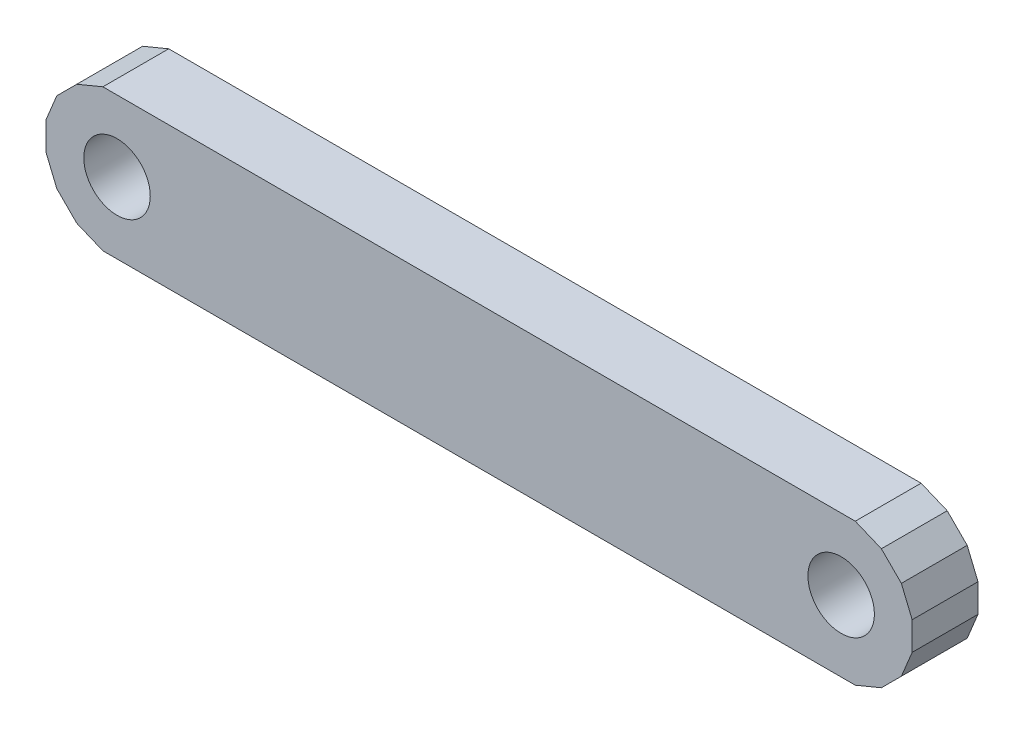
ISO-10303-21;
HEADER;
FILE_DESCRIPTION(('STEP AP214'),'2;1');
FILE_NAME('part.step','',(''),(''),'','','');
FILE_SCHEMA(('AUTOMOTIVE_DESIGN { 1 0 10303 214 1 1 1 1 }'));
ENDSEC;
DATA;
#1=APPLICATION_CONTEXT('core data for automotive mechanical design processes');
#2=APPLICATION_PROTOCOL_DEFINITION('international standard','automotive_design',2000,#1);
#3=PRODUCT_CONTEXT('',#1,'mechanical');
#4=PRODUCT('Part','Part','',(#3));
#5=PRODUCT_RELATED_PRODUCT_CATEGORY('part','',(#4));
#6=PRODUCT_DEFINITION_FORMATION('','',#4);
#7=PRODUCT_DEFINITION_CONTEXT('part definition',#1,'design');
#8=PRODUCT_DEFINITION('design','',#6,#7);
#9=PRODUCT_DEFINITION_SHAPE('','',#8);
#10=(LENGTH_UNIT() NAMED_UNIT(*) SI_UNIT(.MILLI.,.METRE.));
#11=(NAMED_UNIT(*) PLANE_ANGLE_UNIT() SI_UNIT($,.RADIAN.));
#12=(NAMED_UNIT(*) SI_UNIT($,.STERADIAN.) SOLID_ANGLE_UNIT());
#13=UNCERTAINTY_MEASURE_WITH_UNIT(LENGTH_MEASURE(1.E-05),#10,'distance_accuracy_value','');
#14=(GEOMETRIC_REPRESENTATION_CONTEXT(3) GLOBAL_UNCERTAINTY_ASSIGNED_CONTEXT((#13)) GLOBAL_UNIT_ASSIGNED_CONTEXT((#10,
#11,#12)) REPRESENTATION_CONTEXT('',''));
#15=CARTESIAN_POINT('',(0.,0.,0.));
#16=DIRECTION('',(0.,0.,1.));
#17=DIRECTION('',(1.,0.,0.));
#18=AXIS2_PLACEMENT_3D('',#15,#16,#17);
#19=CARTESIAN_POINT('',(0.,0.,18.));
#20=DIRECTION('',(0.,0.,1.));
#21=DIRECTION('',(1.,0.,0.));
#22=AXIS2_PLACEMENT_3D('',#19,#20,#21);
#23=PLANE('',#22);
#24=CARTESIAN_POINT('',(0.,0.,18.));
#25=DIRECTION('',(0.,0.,1.));
#26=DIRECTION('',(1.,0.,0.));
#27=AXIS2_PLACEMENT_3D('',#24,#25,#26);
#28=CIRCLE('',#27,5.05);
#29=CARTESIAN_POINT('',(5.05,0.,18.));
#30=VERTEX_POINT('',#29);
#31=EDGE_CURVE('E192',#30,#30,#28,.T.);
#32=ORIENTED_EDGE('',*,*,#31,.F.);
#33=EDGE_LOOP('',(#32));
#34=FACE_BOUND('',#33,.T.);
#35=DIRECTION('',(-0.382683432365089,-0.923879532511287,0.));
#36=VECTOR('',#35,1.);
#37=CARTESIAN_POINT('',(-9.146165735328,6.11127256321562,18.));
#38=LINE('',#37,#36);
#39=CARTESIAN_POINT('',(-9.146165735328,6.11127256321562,18.));
#40=VERTEX_POINT('',#39);
#41=CARTESIAN_POINT('',(-10.7886380844355,2.14599354217741,18.));
#42=VERTEX_POINT('',#41);
#43=EDGE_CURVE('E219',#40,#42,#38,.T.);
#44=ORIENTED_EDGE('',*,*,#43,.T.);
#45=DIRECTION('',(0.,-1.,0.));
#46=VECTOR('',#45,1.);
#47=CARTESIAN_POINT('',(-10.7886380844355,2.14599354217741,18.));
#48=LINE('',#47,#46);
#49=CARTESIAN_POINT('',(-10.7886380844355,-2.14599354217741,18.));
#50=VERTEX_POINT('',#49);
#51=EDGE_CURVE('E127',#42,#50,#48,.T.);
#52=ORIENTED_EDGE('',*,*,#51,.T.);
#53=DIRECTION('',(0.38268343236509,-0.923879532511287,0.));
#54=VECTOR('',#53,1.);
#55=CARTESIAN_POINT('',(-10.7886380844355,-2.14599354217741,18.));
#56=LINE('',#55,#54);
#57=CARTESIAN_POINT('',(-9.146165735328,-6.11127256321562,18.));
#58=VERTEX_POINT('',#57);
#59=EDGE_CURVE('E258',#50,#58,#56,.T.);
#60=ORIENTED_EDGE('',*,*,#59,.T.);
#61=DIRECTION('',(0.707106781186548,-0.707106781186547,0.));
#62=VECTOR('',#61,1.);
#63=CARTESIAN_POINT('',(-9.146165735328,-6.11127256321562,18.));
#64=LINE('',#63,#62);
#65=CARTESIAN_POINT('',(-6.11127256321562,-9.146165735328,18.));
#66=VERTEX_POINT('',#65);
#67=EDGE_CURVE('E277',#58,#66,#64,.T.);
#68=ORIENTED_EDGE('',*,*,#67,.T.);
#69=DIRECTION('',(0.923879532511287,-0.38268343236509,0.));
#70=VECTOR('',#69,1.);
#71=CARTESIAN_POINT('',(-6.11127256321562,-9.146165735328,18.));
#72=LINE('',#71,#70);
#73=CARTESIAN_POINT('',(-2.14599354217742,-10.7886380844355,18.));
#74=VERTEX_POINT('',#73);
#75=EDGE_CURVE('E274',#66,#74,#72,.T.);
#76=ORIENTED_EDGE('',*,*,#75,.T.);
#77=DIRECTION('',(1.,0.,0.));
#78=VECTOR('',#77,1.);
#79=CARTESIAN_POINT('',(-2.14599354217742,-10.7886380844355,18.));
#80=LINE('',#79,#78);
#81=CARTESIAN_POINT('',(112.145993542177,-10.7886380844355,18.));
#82=VERTEX_POINT('',#81);
#83=EDGE_CURVE('E276',#74,#82,#80,.T.);
#84=ORIENTED_EDGE('',*,*,#83,.T.);
#85=DIRECTION('',(0.923879532511287,0.38268343236509,0.));
#86=VECTOR('',#85,1.);
#87=CARTESIAN_POINT('',(112.145993542177,-10.7886380844355,18.));
#88=LINE('',#87,#86);
#89=CARTESIAN_POINT('',(116.111272563216,-9.146165735328,18.));
#90=VERTEX_POINT('',#89);
#91=EDGE_CURVE('E279',#82,#90,#88,.T.);
#92=ORIENTED_EDGE('',*,*,#91,.T.);
#93=DIRECTION('',(0.707106781186548,0.707106781186547,0.));
#94=VECTOR('',#93,1.);
#95=CARTESIAN_POINT('',(116.111272563216,-9.146165735328,18.));
#96=LINE('',#95,#94);
#97=CARTESIAN_POINT('',(119.146165735328,-6.11127256321562,18.));
#98=VERTEX_POINT('',#97);
#99=EDGE_CURVE('E285',#90,#98,#96,.T.);
#100=ORIENTED_EDGE('',*,*,#99,.T.);
#101=DIRECTION('',(0.382683432365091,0.923879532511286,0.));
#102=VECTOR('',#101,1.);
#103=CARTESIAN_POINT('',(119.146165735328,-6.11127256321562,18.));
#104=LINE('',#103,#102);
#105=CARTESIAN_POINT('',(120.788638084436,-2.14599354217742,18.));
#106=VERTEX_POINT('',#105);
#107=EDGE_CURVE('E287',#98,#106,#104,.T.);
#108=ORIENTED_EDGE('',*,*,#107,.T.);
#109=DIRECTION('',(0.,1.,0.));
#110=VECTOR('',#109,1.);
#111=CARTESIAN_POINT('',(120.788638084436,-2.14599354217742,18.));
#112=LINE('',#111,#110);
#113=CARTESIAN_POINT('',(120.788638084436,2.14599354217741,18.));
#114=VERTEX_POINT('',#113);
#115=EDGE_CURVE('E289',#106,#114,#112,.T.);
#116=ORIENTED_EDGE('',*,*,#115,.T.);
#117=DIRECTION('',(-0.38268343236509,0.923879532511286,0.));
#118=VECTOR('',#117,1.);
#119=CARTESIAN_POINT('',(120.788638084436,2.14599354217741,18.));
#120=LINE('',#119,#118);
#121=CARTESIAN_POINT('',(119.146165735328,6.11127256321562,18.));
#122=VERTEX_POINT('',#121);
#123=EDGE_CURVE('E291',#114,#122,#120,.T.);
#124=ORIENTED_EDGE('',*,*,#123,.T.);
#125=DIRECTION('',(-0.707106781186548,0.707106781186547,0.));
#126=VECTOR('',#125,1.);
#127=CARTESIAN_POINT('',(119.146165735328,6.11127256321562,18.));
#128=LINE('',#127,#126);
#129=CARTESIAN_POINT('',(116.111272563216,9.146165735328,18.));
#130=VERTEX_POINT('',#129);
#131=EDGE_CURVE('E293',#122,#130,#128,.T.);
#132=ORIENTED_EDGE('',*,*,#131,.T.);
#133=DIRECTION('',(-0.923879532511286,0.382683432365091,0.));
#134=VECTOR('',#133,1.);
#135=CARTESIAN_POINT('',(116.111272563216,9.146165735328,18.));
#136=LINE('',#135,#134);
#137=CARTESIAN_POINT('',(112.145993542177,10.7886380844355,18.));
#138=VERTEX_POINT('',#137);
#139=EDGE_CURVE('E170',#130,#138,#136,.T.);
#140=ORIENTED_EDGE('',*,*,#139,.T.);
#141=DIRECTION('',(-1.,0.,0.));
#142=VECTOR('',#141,1.);
#143=CARTESIAN_POINT('',(112.145993542177,10.7886380844355,18.));
#144=LINE('',#143,#142);
#145=CARTESIAN_POINT('',(-2.14599354217741,10.7886380844355,18.));
#146=VERTEX_POINT('',#145);
#147=EDGE_CURVE('E164',#138,#146,#144,.T.);
#148=ORIENTED_EDGE('',*,*,#147,.T.);
#149=DIRECTION('',(-0.923879532511287,-0.38268343236509,0.));
#150=VECTOR('',#149,1.);
#151=CARTESIAN_POINT('',(-2.14599354217741,10.7886380844355,18.));
#152=LINE('',#151,#150);
#153=CARTESIAN_POINT('',(-6.11127256321562,9.146165735328,18.));
#154=VERTEX_POINT('',#153);
#155=EDGE_CURVE('E168',#146,#154,#152,.T.);
#156=ORIENTED_EDGE('',*,*,#155,.T.);
#157=DIRECTION('',(-0.707106781186548,-0.707106781186547,0.));
#158=VECTOR('',#157,1.);
#159=CARTESIAN_POINT('',(-6.11127256321562,9.146165735328,18.));
#160=LINE('',#159,#158);
#161=EDGE_CURVE('E60',#154,#40,#160,.T.);
#162=ORIENTED_EDGE('',*,*,#161,.T.);
#163=EDGE_LOOP('',(#44,#52,#60,#68,#76,#84,#92,#100,#108,#116,#124,#132,#140,#148,#156,#162));
#164=FACE_BOUND('',#163,.T.);
#165=CARTESIAN_POINT('',(110.,0.,18.));
#166=DIRECTION('',(0.,0.,1.));
#167=DIRECTION('',(1.,0.,0.));
#168=AXIS2_PLACEMENT_3D('',#165,#166,#167);
#169=CIRCLE('',#168,5.05);
#170=CARTESIAN_POINT('',(115.05,0.,18.));
#171=VERTEX_POINT('',#170);
#172=EDGE_CURVE('E335',#171,#171,#169,.T.);
#173=ORIENTED_EDGE('',*,*,#172,.F.);
#174=EDGE_LOOP('',(#173));
#175=FACE_BOUND('',#174,.T.);
#176=ADVANCED_FACE('F43',(#34,#164,#175),#23,.T.);
#177=CARTESIAN_POINT('',(0.,0.,8.));
#178=DIRECTION('',(0.,0.,1.));
#179=DIRECTION('',(1.,0.,0.));
#180=AXIS2_PLACEMENT_3D('',#177,#178,#179);
#181=PLANE('',#180);
#182=DIRECTION('',(-0.382683432365089,-0.923879532511287,0.));
#183=VECTOR('',#182,1.);
#184=CARTESIAN_POINT('',(-9.146165735328,6.11127256321562,8.));
#185=LINE('',#184,#183);
#186=CARTESIAN_POINT('',(-9.146165735328,6.11127256321562,8.));
#187=VERTEX_POINT('',#186);
#188=CARTESIAN_POINT('',(-10.7886380844355,2.14599354217741,8.));
#189=VERTEX_POINT('',#188);
#190=EDGE_CURVE('E188',#187,#189,#185,.T.);
#191=ORIENTED_EDGE('',*,*,#190,.F.);
#192=DIRECTION('',(-0.707106781186548,-0.707106781186547,0.));
#193=VECTOR('',#192,1.);
#194=CARTESIAN_POINT('',(-6.11127256321562,9.146165735328,8.));
#195=LINE('',#194,#193);
#196=CARTESIAN_POINT('',(-6.11127256321562,9.146165735328,8.));
#197=VERTEX_POINT('',#196);
#198=EDGE_CURVE('E119',#197,#187,#195,.T.);
#199=ORIENTED_EDGE('',*,*,#198,.F.);
#200=DIRECTION('',(-0.923879532511287,-0.38268343236509,0.));
#201=VECTOR('',#200,1.);
#202=CARTESIAN_POINT('',(-2.14599354217741,10.7886380844355,8.));
#203=LINE('',#202,#201);
#204=CARTESIAN_POINT('',(-2.14599354217741,10.7886380844355,8.));
#205=VERTEX_POINT('',#204);
#206=EDGE_CURVE('E113',#205,#197,#203,.T.);
#207=ORIENTED_EDGE('',*,*,#206,.F.);
#208=DIRECTION('',(-1.,0.,0.));
#209=VECTOR('',#208,1.);
#210=CARTESIAN_POINT('',(112.145993542177,10.7886380844355,8.));
#211=LINE('',#210,#209);
#212=CARTESIAN_POINT('',(112.145993542177,10.7886380844355,8.));
#213=VERTEX_POINT('',#212);
#214=EDGE_CURVE('E178',#213,#205,#211,.T.);
#215=ORIENTED_EDGE('',*,*,#214,.F.);
#216=DIRECTION('',(-0.923879532511286,0.382683432365091,0.));
#217=VECTOR('',#216,1.);
#218=CARTESIAN_POINT('',(116.111272563216,9.146165735328,8.));
#219=LINE('',#218,#217);
#220=CARTESIAN_POINT('',(116.111272563216,9.146165735328,8.));
#221=VERTEX_POINT('',#220);
#222=EDGE_CURVE('E214',#221,#213,#219,.T.);
#223=ORIENTED_EDGE('',*,*,#222,.F.);
#224=DIRECTION('',(-0.707106781186548,0.707106781186547,0.));
#225=VECTOR('',#224,1.);
#226=CARTESIAN_POINT('',(119.146165735328,6.11127256321562,8.));
#227=LINE('',#226,#225);
#228=CARTESIAN_POINT('',(119.146165735328,6.11127256321562,8.));
#229=VERTEX_POINT('',#228);
#230=EDGE_CURVE('E212',#229,#221,#227,.T.);
#231=ORIENTED_EDGE('',*,*,#230,.F.);
#232=DIRECTION('',(-0.38268343236509,0.923879532511286,0.));
#233=VECTOR('',#232,1.);
#234=CARTESIAN_POINT('',(120.788638084436,2.14599354217741,8.));
#235=LINE('',#234,#233);
#236=CARTESIAN_POINT('',(120.788638084436,2.14599354217741,8.));
#237=VERTEX_POINT('',#236);
#238=EDGE_CURVE('E210',#237,#229,#235,.T.);
#239=ORIENTED_EDGE('',*,*,#238,.F.);
#240=DIRECTION('',(0.,1.,0.));
#241=VECTOR('',#240,1.);
#242=CARTESIAN_POINT('',(120.788638084436,-2.14599354217742,8.));
#243=LINE('',#242,#241);
#244=CARTESIAN_POINT('',(120.788638084436,-2.14599354217742,8.));
#245=VERTEX_POINT('',#244);
#246=EDGE_CURVE('E208',#245,#237,#243,.T.);
#247=ORIENTED_EDGE('',*,*,#246,.F.);
#248=DIRECTION('',(0.382683432365091,0.923879532511286,0.));
#249=VECTOR('',#248,1.);
#250=CARTESIAN_POINT('',(119.146165735328,-6.11127256321562,8.));
#251=LINE('',#250,#249);
#252=CARTESIAN_POINT('',(119.146165735328,-6.11127256321562,8.));
#253=VERTEX_POINT('',#252);
#254=EDGE_CURVE('E206',#253,#245,#251,.T.);
#255=ORIENTED_EDGE('',*,*,#254,.F.);
#256=DIRECTION('',(0.707106781186548,0.707106781186547,0.));
#257=VECTOR('',#256,1.);
#258=CARTESIAN_POINT('',(116.111272563216,-9.146165735328,8.));
#259=LINE('',#258,#257);
#260=CARTESIAN_POINT('',(116.111272563216,-9.146165735328,8.));
#261=VERTEX_POINT('',#260);
#262=EDGE_CURVE('E204',#261,#253,#259,.T.);
#263=ORIENTED_EDGE('',*,*,#262,.F.);
#264=DIRECTION('',(0.923879532511287,0.38268343236509,0.));
#265=VECTOR('',#264,1.);
#266=CARTESIAN_POINT('',(112.145993542177,-10.7886380844355,8.));
#267=LINE('',#266,#265);
#268=CARTESIAN_POINT('',(112.145993542177,-10.7886380844355,8.));
#269=VERTEX_POINT('',#268);
#270=EDGE_CURVE('E202',#269,#261,#267,.T.);
#271=ORIENTED_EDGE('',*,*,#270,.F.);
#272=DIRECTION('',(1.,0.,0.));
#273=VECTOR('',#272,1.);
#274=CARTESIAN_POINT('',(-2.14599354217742,-10.7886380844355,8.));
#275=LINE('',#274,#273);
#276=CARTESIAN_POINT('',(-2.14599354217742,-10.7886380844355,8.));
#277=VERTEX_POINT('',#276);
#278=EDGE_CURVE('E200',#277,#269,#275,.T.);
#279=ORIENTED_EDGE('',*,*,#278,.F.);
#280=DIRECTION('',(0.923879532511287,-0.38268343236509,0.));
#281=VECTOR('',#280,1.);
#282=CARTESIAN_POINT('',(-6.11127256321562,-9.146165735328,8.));
#283=LINE('',#282,#281);
#284=CARTESIAN_POINT('',(-6.11127256321562,-9.146165735328,8.));
#285=VERTEX_POINT('',#284);
#286=EDGE_CURVE('E198',#285,#277,#283,.T.);
#287=ORIENTED_EDGE('',*,*,#286,.F.);
#288=DIRECTION('',(0.707106781186548,-0.707106781186547,0.));
#289=VECTOR('',#288,1.);
#290=CARTESIAN_POINT('',(-9.146165735328,-6.11127256321562,8.));
#291=LINE('',#290,#289);
#292=CARTESIAN_POINT('',(-9.146165735328,-6.11127256321562,8.));
#293=VERTEX_POINT('',#292);
#294=EDGE_CURVE('E196',#293,#285,#291,.T.);
#295=ORIENTED_EDGE('',*,*,#294,.F.);
#296=DIRECTION('',(0.38268343236509,-0.923879532511287,0.));
#297=VECTOR('',#296,1.);
#298=CARTESIAN_POINT('',(-10.7886380844355,-2.14599354217741,8.));
#299=LINE('',#298,#297);
#300=CARTESIAN_POINT('',(-10.7886380844355,-2.14599354217741,8.));
#301=VERTEX_POINT('',#300);
#302=EDGE_CURVE('E194',#301,#293,#299,.T.);
#303=ORIENTED_EDGE('',*,*,#302,.F.);
#304=DIRECTION('',(0.,-1.,0.));
#305=VECTOR('',#304,1.);
#306=CARTESIAN_POINT('',(-10.7886380844355,2.14599354217741,8.));
#307=LINE('',#306,#305);
#308=EDGE_CURVE('E191',#189,#301,#307,.T.);
#309=ORIENTED_EDGE('',*,*,#308,.F.);
#310=EDGE_LOOP('',(#191,#199,#207,#215,#223,#231,#239,#247,#255,#263,#271,#279,#287,#295,#303,#309));
#311=FACE_BOUND('',#310,.T.);
#312=CARTESIAN_POINT('',(0.,0.,8.));
#313=DIRECTION('',(0.,0.,1.));
#314=DIRECTION('',(1.,0.,0.));
#315=AXIS2_PLACEMENT_3D('',#312,#313,#314);
#316=CIRCLE('',#315,5.05);
#317=CARTESIAN_POINT('',(5.05,0.,8.));
#318=VERTEX_POINT('',#317);
#319=EDGE_CURVE('E341',#318,#318,#316,.T.);
#320=ORIENTED_EDGE('',*,*,#319,.T.);
#321=EDGE_LOOP('',(#320));
#322=FACE_BOUND('',#321,.T.);
#323=CARTESIAN_POINT('',(110.,0.,8.));
#324=DIRECTION('',(0.,0.,1.));
#325=DIRECTION('',(1.,0.,0.));
#326=AXIS2_PLACEMENT_3D('',#323,#324,#325);
#327=CIRCLE('',#326,5.05);
#328=CARTESIAN_POINT('',(115.05,0.,8.));
#329=VERTEX_POINT('',#328);
#330=EDGE_CURVE('E338',#329,#329,#327,.T.);
#331=ORIENTED_EDGE('',*,*,#330,.T.);
#332=EDGE_LOOP('',(#331));
#333=FACE_BOUND('',#332,.T.);
#334=ADVANCED_FACE('F262',(#311,#322,#333),#181,.F.);
#335=CARTESIAN_POINT('',(-9.146165735328,6.11127256321562,18.));
#336=DIRECTION('',(0.923879532511287,-0.382683432365089,0.));
#337=DIRECTION('',(0.382683432365089,0.923879532511287,0.));
#338=AXIS2_PLACEMENT_3D('',#335,#336,#337);
#339=PLANE('',#338);
#340=ORIENTED_EDGE('',*,*,#190,.T.);
#341=DIRECTION('',(0.,0.,-1.));
#342=VECTOR('',#341,1.);
#343=CARTESIAN_POINT('',(-10.7886380844355,2.14599354217741,18.));
#344=LINE('',#343,#342);
#345=EDGE_CURVE('E11',#42,#189,#344,.T.);
#346=ORIENTED_EDGE('',*,*,#345,.F.);
#347=ORIENTED_EDGE('',*,*,#43,.F.);
#348=DIRECTION('',(0.,0.,-1.));
#349=VECTOR('',#348,1.);
#350=CARTESIAN_POINT('',(-9.146165735328,6.11127256321562,18.));
#351=LINE('',#350,#349);
#352=EDGE_CURVE('E184',#40,#187,#351,.T.);
#353=ORIENTED_EDGE('',*,*,#352,.T.);
#354=EDGE_LOOP('',(#340,#346,#347,#353));
#355=FACE_BOUND('',#354,.T.);
#356=ADVANCED_FACE('F45',(#355),#339,.F.);
#357=CARTESIAN_POINT('',(-10.7886380844355,2.14599354217741,18.));
#358=DIRECTION('',(1.,0.,0.));
#359=DIRECTION('',(0.,0.,-1.));
#360=AXIS2_PLACEMENT_3D('',#357,#358,#359);
#361=PLANE('',#360);
#362=ORIENTED_EDGE('',*,*,#308,.T.);
#363=DIRECTION('',(0.,0.,-1.));
#364=VECTOR('',#363,1.);
#365=CARTESIAN_POINT('',(-10.7886380844355,-2.14599354217741,18.));
#366=LINE('',#365,#364);
#367=EDGE_CURVE('E52',#50,#301,#366,.T.);
#368=ORIENTED_EDGE('',*,*,#367,.F.);
#369=ORIENTED_EDGE('',*,*,#51,.F.);
#370=ORIENTED_EDGE('',*,*,#345,.T.);
#371=EDGE_LOOP('',(#362,#368,#369,#370));
#372=FACE_BOUND('',#371,.T.);
#373=ADVANCED_FACE('F476',(#372),#361,.F.);
#374=CARTESIAN_POINT('',(-10.7886380844355,-2.14599354217741,18.));
#375=DIRECTION('',(0.923879532511287,0.38268343236509,0.));
#376=DIRECTION('',(-0.38268343236509,0.923879532511287,0.));
#377=AXIS2_PLACEMENT_3D('',#374,#375,#376);
#378=PLANE('',#377);
#379=ORIENTED_EDGE('',*,*,#302,.T.);
#380=DIRECTION('',(0.,0.,-1.));
#381=VECTOR('',#380,1.);
#382=CARTESIAN_POINT('',(-9.146165735328,-6.11127256321562,18.));
#383=LINE('',#382,#381);
#384=EDGE_CURVE('E250',#58,#293,#383,.T.);
#385=ORIENTED_EDGE('',*,*,#384,.F.);
#386=ORIENTED_EDGE('',*,*,#59,.F.);
#387=ORIENTED_EDGE('',*,*,#367,.T.);
#388=EDGE_LOOP('',(#379,#385,#386,#387));
#389=FACE_BOUND('',#388,.T.);
#390=ADVANCED_FACE('F256',(#389),#378,.F.);
#391=CARTESIAN_POINT('',(-9.146165735328,-6.11127256321562,18.));
#392=DIRECTION('',(0.707106781186547,0.707106781186548,0.));
#393=DIRECTION('',(-0.707106781186548,0.707106781186547,0.));
#394=AXIS2_PLACEMENT_3D('',#391,#392,#393);
#395=PLANE('',#394);
#396=ORIENTED_EDGE('',*,*,#294,.T.);
#397=DIRECTION('',(0.,0.,-1.));
#398=VECTOR('',#397,1.);
#399=CARTESIAN_POINT('',(-6.11127256321562,-9.146165735328,18.));
#400=LINE('',#399,#398);
#401=EDGE_CURVE('E247',#66,#285,#400,.T.);
#402=ORIENTED_EDGE('',*,*,#401,.F.);
#403=ORIENTED_EDGE('',*,*,#67,.F.);
#404=ORIENTED_EDGE('',*,*,#384,.T.);
#405=EDGE_LOOP('',(#396,#402,#403,#404));
#406=FACE_BOUND('',#405,.T.);
#407=ADVANCED_FACE('F268',(#406),#395,.F.);
#408=CARTESIAN_POINT('',(-6.11127256321562,-9.146165735328,18.));
#409=DIRECTION('',(0.38268343236509,0.923879532511287,0.));
#410=DIRECTION('',(-0.923879532511287,0.38268343236509,0.));
#411=AXIS2_PLACEMENT_3D('',#408,#409,#410);
#412=PLANE('',#411);
#413=ORIENTED_EDGE('',*,*,#286,.T.);
#414=DIRECTION('',(0.,0.,-1.));
#415=VECTOR('',#414,1.);
#416=CARTESIAN_POINT('',(-2.14599354217742,-10.7886380844355,18.));
#417=LINE('',#416,#415);
#418=EDGE_CURVE('E244',#74,#277,#417,.T.);
#419=ORIENTED_EDGE('',*,*,#418,.F.);
#420=ORIENTED_EDGE('',*,*,#75,.F.);
#421=ORIENTED_EDGE('',*,*,#401,.T.);
#422=EDGE_LOOP('',(#413,#419,#420,#421));
#423=FACE_BOUND('',#422,.T.);
#424=ADVANCED_FACE('F272',(#423),#412,.F.);
#425=CARTESIAN_POINT('',(-2.14599354217742,-10.7886380844355,18.));
#426=DIRECTION('',(0.,1.,0.));
#427=DIRECTION('',(-1.,0.,0.));
#428=AXIS2_PLACEMENT_3D('',#425,#426,#427);
#429=PLANE('',#428);
#430=ORIENTED_EDGE('',*,*,#278,.T.);
#431=DIRECTION('',(0.,0.,-1.));
#432=VECTOR('',#431,1.);
#433=CARTESIAN_POINT('',(112.145993542177,-10.7886380844355,18.));
#434=LINE('',#433,#432);
#435=EDGE_CURVE('E241',#82,#269,#434,.T.);
#436=ORIENTED_EDGE('',*,*,#435,.F.);
#437=ORIENTED_EDGE('',*,*,#83,.F.);
#438=ORIENTED_EDGE('',*,*,#418,.T.);
#439=EDGE_LOOP('',(#430,#436,#437,#438));
#440=FACE_BOUND('',#439,.T.);
#441=ADVANCED_FACE('F441',(#440),#429,.F.);
#442=CARTESIAN_POINT('',(112.145993542177,-10.7886380844355,18.));
#443=DIRECTION('',(-0.38268343236509,0.923879532511287,0.));
#444=DIRECTION('',(-0.923879532511287,-0.38268343236509,0.));
#445=AXIS2_PLACEMENT_3D('',#442,#443,#444);
#446=PLANE('',#445);
#447=ORIENTED_EDGE('',*,*,#270,.T.);
#448=DIRECTION('',(0.,0.,-1.));
#449=VECTOR('',#448,1.);
#450=CARTESIAN_POINT('',(116.111272563216,-9.146165735328,18.));
#451=LINE('',#450,#449);
#452=EDGE_CURVE('E238',#90,#261,#451,.T.);
#453=ORIENTED_EDGE('',*,*,#452,.F.);
#454=ORIENTED_EDGE('',*,*,#91,.F.);
#455=ORIENTED_EDGE('',*,*,#435,.T.);
#456=EDGE_LOOP('',(#447,#453,#454,#455));
#457=FACE_BOUND('',#456,.T.);
#458=ADVANCED_FACE('F431',(#457),#446,.F.);
#459=CARTESIAN_POINT('',(116.111272563216,-9.146165735328,18.));
#460=DIRECTION('',(-0.707106781186547,0.707106781186548,0.));
#461=DIRECTION('',(-0.707106781186548,-0.707106781186547,0.));
#462=AXIS2_PLACEMENT_3D('',#459,#460,#461);
#463=PLANE('',#462);
#464=ORIENTED_EDGE('',*,*,#262,.T.);
#465=DIRECTION('',(0.,0.,-1.));
#466=VECTOR('',#465,1.);
#467=CARTESIAN_POINT('',(119.146165735328,-6.11127256321562,18.));
#468=LINE('',#467,#466);
#469=EDGE_CURVE('E235',#98,#253,#468,.T.);
#470=ORIENTED_EDGE('',*,*,#469,.F.);
#471=ORIENTED_EDGE('',*,*,#99,.F.);
#472=ORIENTED_EDGE('',*,*,#452,.T.);
#473=EDGE_LOOP('',(#464,#470,#471,#472));
#474=FACE_BOUND('',#473,.T.);
#475=ADVANCED_FACE('F421',(#474),#463,.F.);
#476=CARTESIAN_POINT('',(119.146165735328,-6.11127256321562,18.));
#477=DIRECTION('',(-0.923879532511286,0.382683432365091,0.));
#478=DIRECTION('',(-0.382683432365091,-0.923879532511286,0.));
#479=AXIS2_PLACEMENT_3D('',#476,#477,#478);
#480=PLANE('',#479);
#481=ORIENTED_EDGE('',*,*,#254,.T.);
#482=DIRECTION('',(0.,0.,-1.));
#483=VECTOR('',#482,1.);
#484=CARTESIAN_POINT('',(120.788638084436,-2.14599354217742,18.));
#485=LINE('',#484,#483);
#486=EDGE_CURVE('E232',#106,#245,#485,.T.);
#487=ORIENTED_EDGE('',*,*,#486,.F.);
#488=ORIENTED_EDGE('',*,*,#107,.F.);
#489=ORIENTED_EDGE('',*,*,#469,.T.);
#490=EDGE_LOOP('',(#481,#487,#488,#489));
#491=FACE_BOUND('',#490,.T.);
#492=ADVANCED_FACE('F411',(#491),#480,.F.);
#493=CARTESIAN_POINT('',(120.788638084436,-2.14599354217742,18.));
#494=DIRECTION('',(-1.,0.,0.));
#495=DIRECTION('',(0.,0.,1.));
#496=AXIS2_PLACEMENT_3D('',#493,#494,#495);
#497=PLANE('',#496);
#498=ORIENTED_EDGE('',*,*,#246,.T.);
#499=DIRECTION('',(0.,0.,-1.));
#500=VECTOR('',#499,1.);
#501=CARTESIAN_POINT('',(120.788638084436,2.14599354217741,18.));
#502=LINE('',#501,#500);
#503=EDGE_CURVE('E229',#114,#237,#502,.T.);
#504=ORIENTED_EDGE('',*,*,#503,.F.);
#505=ORIENTED_EDGE('',*,*,#115,.F.);
#506=ORIENTED_EDGE('',*,*,#486,.T.);
#507=EDGE_LOOP('',(#498,#504,#505,#506));
#508=FACE_BOUND('',#507,.T.);
#509=ADVANCED_FACE('F401',(#508),#497,.F.);
#510=CARTESIAN_POINT('',(120.788638084436,2.14599354217741,18.));
#511=DIRECTION('',(-0.923879532511287,-0.38268343236509,0.));
#512=DIRECTION('',(0.38268343236509,-0.923879532511287,0.));
#513=AXIS2_PLACEMENT_3D('',#510,#511,#512);
#514=PLANE('',#513);
#515=ORIENTED_EDGE('',*,*,#238,.T.);
#516=DIRECTION('',(0.,0.,-1.));
#517=VECTOR('',#516,1.);
#518=CARTESIAN_POINT('',(119.146165735328,6.11127256321562,18.));
#519=LINE('',#518,#517);
#520=EDGE_CURVE('E226',#122,#229,#519,.T.);
#521=ORIENTED_EDGE('',*,*,#520,.F.);
#522=ORIENTED_EDGE('',*,*,#123,.F.);
#523=ORIENTED_EDGE('',*,*,#503,.T.);
#524=EDGE_LOOP('',(#515,#521,#522,#523));
#525=FACE_BOUND('',#524,.T.);
#526=ADVANCED_FACE('F392',(#525),#514,.F.);
#527=CARTESIAN_POINT('',(119.146165735328,6.11127256321562,18.));
#528=DIRECTION('',(-0.707106781186547,-0.707106781186548,0.));
#529=DIRECTION('',(0.707106781186548,-0.707106781186547,0.));
#530=AXIS2_PLACEMENT_3D('',#527,#528,#529);
#531=PLANE('',#530);
#532=ORIENTED_EDGE('',*,*,#230,.T.);
#533=DIRECTION('',(0.,0.,-1.));
#534=VECTOR('',#533,1.);
#535=CARTESIAN_POINT('',(116.111272563216,9.146165735328,18.));
#536=LINE('',#535,#534);
#537=EDGE_CURVE('E223',#130,#221,#536,.T.);
#538=ORIENTED_EDGE('',*,*,#537,.F.);
#539=ORIENTED_EDGE('',*,*,#131,.F.);
#540=ORIENTED_EDGE('',*,*,#520,.T.);
#541=EDGE_LOOP('',(#532,#538,#539,#540));
#542=FACE_BOUND('',#541,.T.);
#543=ADVANCED_FACE('F299',(#542),#531,.F.);
#544=CARTESIAN_POINT('',(116.111272563216,9.146165735328,18.));
#545=DIRECTION('',(-0.382683432365091,-0.923879532511287,0.));
#546=DIRECTION('',(0.923879532511287,-0.382683432365091,0.));
#547=AXIS2_PLACEMENT_3D('',#544,#545,#546);
#548=PLANE('',#547);
#549=ORIENTED_EDGE('',*,*,#222,.T.);
#550=DIRECTION('',(0.,0.,-1.));
#551=VECTOR('',#550,1.);
#552=CARTESIAN_POINT('',(112.145993542177,10.7886380844355,18.));
#553=LINE('',#552,#551);
#554=EDGE_CURVE('E179',#138,#213,#553,.T.);
#555=ORIENTED_EDGE('',*,*,#554,.F.);
#556=ORIENTED_EDGE('',*,*,#139,.F.);
#557=ORIENTED_EDGE('',*,*,#537,.T.);
#558=EDGE_LOOP('',(#549,#555,#556,#557));
#559=FACE_BOUND('',#558,.T.);
#560=ADVANCED_FACE('F303',(#559),#548,.F.);
#561=CARTESIAN_POINT('',(112.145993542177,10.7886380844355,18.));
#562=DIRECTION('',(0.,-1.,0.));
#563=DIRECTION('',(0.,0.,-1.));
#564=AXIS2_PLACEMENT_3D('',#561,#562,#563);
#565=PLANE('',#564);
#566=ORIENTED_EDGE('',*,*,#214,.T.);
#567=DIRECTION('',(0.,0.,-1.));
#568=VECTOR('',#567,1.);
#569=CARTESIAN_POINT('',(-2.14599354217741,10.7886380844355,18.));
#570=LINE('',#569,#568);
#571=EDGE_CURVE('E175',#146,#205,#570,.T.);
#572=ORIENTED_EDGE('',*,*,#571,.F.);
#573=ORIENTED_EDGE('',*,*,#147,.F.);
#574=ORIENTED_EDGE('',*,*,#554,.T.);
#575=EDGE_LOOP('',(#566,#572,#573,#574));
#576=FACE_BOUND('',#575,.T.);
#577=ADVANCED_FACE('F176',(#576),#565,.F.);
#578=CARTESIAN_POINT('',(-2.14599354217741,10.7886380844355,18.));
#579=DIRECTION('',(0.38268343236509,-0.923879532511287,0.));
#580=DIRECTION('',(0.923879532511287,0.38268343236509,0.));
#581=AXIS2_PLACEMENT_3D('',#578,#579,#580);
#582=PLANE('',#581);
#583=ORIENTED_EDGE('',*,*,#206,.T.);
#584=DIRECTION('',(0.,0.,-1.));
#585=VECTOR('',#584,1.);
#586=CARTESIAN_POINT('',(-6.11127256321562,9.146165735328,18.));
#587=LINE('',#586,#585);
#588=EDGE_CURVE('E180',#154,#197,#587,.T.);
#589=ORIENTED_EDGE('',*,*,#588,.F.);
#590=ORIENTED_EDGE('',*,*,#155,.F.);
#591=ORIENTED_EDGE('',*,*,#571,.T.);
#592=EDGE_LOOP('',(#583,#589,#590,#591));
#593=FACE_BOUND('',#592,.T.);
#594=ADVANCED_FACE('F182',(#593),#582,.F.);
#595=CARTESIAN_POINT('',(-6.11127256321562,9.146165735328,18.));
#596=DIRECTION('',(0.707106781186547,-0.707106781186548,0.));
#597=DIRECTION('',(0.707106781186548,0.707106781186547,0.));
#598=AXIS2_PLACEMENT_3D('',#595,#596,#597);
#599=PLANE('',#598);
#600=ORIENTED_EDGE('',*,*,#198,.T.);
#601=ORIENTED_EDGE('',*,*,#352,.F.);
#602=ORIENTED_EDGE('',*,*,#161,.F.);
#603=ORIENTED_EDGE('',*,*,#588,.T.);
#604=EDGE_LOOP('',(#600,#601,#602,#603));
#605=FACE_BOUND('',#604,.T.);
#606=ADVANCED_FACE('F307',(#605),#599,.F.);
#607=CARTESIAN_POINT('',(0.,0.,18.));
#608=DIRECTION('',(0.,0.,-1.));
#609=DIRECTION('',(-1.,0.,0.));
#610=AXIS2_PLACEMENT_3D('',#607,#608,#609);
#611=CYLINDRICAL_SURFACE('',#610,5.05);
#612=ORIENTED_EDGE('',*,*,#31,.T.);
#613=EDGE_LOOP('',(#612));
#614=FACE_BOUND('',#613,.T.);
#615=ORIENTED_EDGE('',*,*,#319,.F.);
#616=EDGE_LOOP('',(#615));
#617=FACE_BOUND('',#616,.T.);
#618=ADVANCED_FACE('F309',(#614,#617),#611,.F.);
#619=CARTESIAN_POINT('',(110.,0.,18.));
#620=DIRECTION('',(0.,0.,-1.));
#621=DIRECTION('',(-1.,0.,0.));
#622=AXIS2_PLACEMENT_3D('',#619,#620,#621);
#623=CYLINDRICAL_SURFACE('',#622,5.05);
#624=ORIENTED_EDGE('',*,*,#172,.T.);
#625=EDGE_LOOP('',(#624));
#626=FACE_BOUND('',#625,.T.);
#627=ORIENTED_EDGE('',*,*,#330,.F.);
#628=EDGE_LOOP('',(#627));
#629=FACE_BOUND('',#628,.T.);
#630=ADVANCED_FACE('F315',(#626,#629),#623,.F.);
#631=CLOSED_SHELL('',(#176,#334,#356,#373,#390,#407,#424,#441,#458,#475,#492,#509,#526,#543,
#560,#577,#594,#606,#618,#630));
#632=MANIFOLD_SOLID_BREP('B2',#631);
#633=ADVANCED_BREP_SHAPE_REPRESENTATION('',(#18,#632),#14);
#634=SHAPE_DEFINITION_REPRESENTATION(#9,#633);
ENDSEC;
END-ISO-10303-21;
